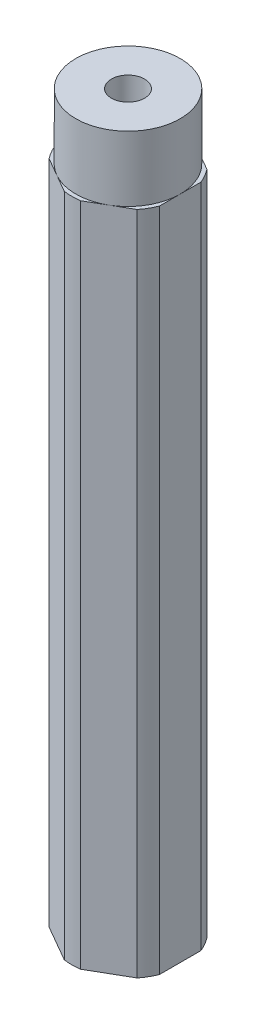
ISO-10303-21;
HEADER;
FILE_DESCRIPTION(('STEP AP214'),'2;1');
FILE_NAME('part.step','',(''),(''),'','','');
FILE_SCHEMA(('AUTOMOTIVE_DESIGN { 1 0 10303 214 1 1 1 1 }'));
ENDSEC;
DATA;
#1=APPLICATION_CONTEXT('core data for automotive mechanical design processes');
#2=APPLICATION_PROTOCOL_DEFINITION('international standard','automotive_design',2000,#1);
#3=PRODUCT_CONTEXT('',#1,'mechanical');
#4=PRODUCT('Part','Part','',(#3));
#5=PRODUCT_RELATED_PRODUCT_CATEGORY('part','',(#4));
#6=PRODUCT_DEFINITION_FORMATION('','',#4);
#7=PRODUCT_DEFINITION_CONTEXT('part definition',#1,'design');
#8=PRODUCT_DEFINITION('design','',#6,#7);
#9=PRODUCT_DEFINITION_SHAPE('','',#8);
#10=(LENGTH_UNIT() NAMED_UNIT(*) SI_UNIT(.MILLI.,.METRE.));
#11=(NAMED_UNIT(*) PLANE_ANGLE_UNIT() SI_UNIT($,.RADIAN.));
#12=(NAMED_UNIT(*) SI_UNIT($,.STERADIAN.) SOLID_ANGLE_UNIT());
#13=UNCERTAINTY_MEASURE_WITH_UNIT(LENGTH_MEASURE(1.E-05),#10,'distance_accuracy_value','');
#14=(GEOMETRIC_REPRESENTATION_CONTEXT(3) GLOBAL_UNCERTAINTY_ASSIGNED_CONTEXT((#13)) GLOBAL_UNIT_ASSIGNED_CONTEXT((#10,
#11,#12)) REPRESENTATION_CONTEXT('',''));
#15=CARTESIAN_POINT('',(0.,0.,0.));
#16=DIRECTION('',(0.,0.,1.));
#17=DIRECTION('',(1.,0.,0.));
#18=AXIS2_PLACEMENT_3D('',#15,#16,#17);
#19=CARTESIAN_POINT('',(0.,40.48125,0.));
#20=DIRECTION('',(0.,1.,0.));
#21=DIRECTION('',(0.,0.,1.));
#22=AXIS2_PLACEMENT_3D('',#19,#20,#21);
#23=PLANE('',#22);
#24=CARTESIAN_POINT('',(0.,40.48125,0.));
#25=DIRECTION('',(0.,1.,0.));
#26=DIRECTION('',(0.,0.,1.));
#27=AXIS2_PLACEMENT_3D('',#24,#25,#26);
#28=CIRCLE('',#27,6.35);
#29=CARTESIAN_POINT('',(3.175,40.48125,5.49926131403119));
#30=VERTEX_POINT('',#29);
#31=CARTESIAN_POINT('',(6.35,40.48125,0.));
#32=VERTEX_POINT('',#31);
#33=EDGE_CURVE('E64',#30,#32,#28,.T.);
#34=ORIENTED_EDGE('',*,*,#33,.F.);
#35=DIRECTION('',(0.866025403784439,0.,-0.5));
#36=VECTOR('',#35,1.);
#37=CARTESIAN_POINT('',(3.175,40.48125,5.49926131403119));
#38=LINE('',#37,#36);
#39=CARTESIAN_POINT('',(5.35936308108336,40.48125,4.23811870115983));
#40=VERTEX_POINT('',#39);
#41=EDGE_CURVE('E171',#30,#40,#38,.T.);
#42=ORIENTED_EDGE('',*,*,#41,.T.);
#43=CARTESIAN_POINT('',(0.,40.48125,0.));
#44=DIRECTION('',(0.,1.,0.));
#45=DIRECTION('',(0.,0.,1.));
#46=AXIS2_PLACEMENT_3D('',#43,#44,#45);
#47=CIRCLE('',#46,6.8326);
#48=CARTESIAN_POINT('',(6.35,40.48125,2.52228522574271));
#49=VERTEX_POINT('',#48);
#50=EDGE_CURVE('E170',#40,#49,#47,.T.);
#51=ORIENTED_EDGE('',*,*,#50,.T.);
#52=DIRECTION('',(0.,0.,-1.));
#53=VECTOR('',#52,1.);
#54=CARTESIAN_POINT('',(6.35,40.48125,0.));
#55=LINE('',#54,#53);
#56=EDGE_CURVE('E183',#49,#32,#55,.T.);
#57=ORIENTED_EDGE('',*,*,#56,.T.);
#58=EDGE_LOOP('',(#34,#42,#51,#57));
#59=FACE_BOUND('',#58,.T.);
#60=ADVANCED_FACE('F53',(#59),#23,.T.);
#61=CARTESIAN_POINT('',(3.175,40.48125,-5.49926131403119));
#62=VERTEX_POINT('',#61);
#63=EDGE_CURVE('E11',#32,#62,#28,.T.);
#64=ORIENTED_EDGE('',*,*,#63,.F.);
#65=CARTESIAN_POINT('',(6.35,40.48125,-2.52228522574271));
#66=VERTEX_POINT('',#65);
#67=EDGE_CURVE('E195',#32,#66,#55,.T.);
#68=ORIENTED_EDGE('',*,*,#67,.T.);
#69=CARTESIAN_POINT('',(5.35936308108336,40.48125,-4.23811870115983));
#70=VERTEX_POINT('',#69);
#71=EDGE_CURVE('E196',#66,#70,#47,.T.);
#72=ORIENTED_EDGE('',*,*,#71,.T.);
#73=DIRECTION('',(-0.866025403784439,0.,-0.5));
#74=VECTOR('',#73,1.);
#75=CARTESIAN_POINT('',(3.175,40.48125,-5.49926131403119));
#76=LINE('',#75,#74);
#77=EDGE_CURVE('E198',#70,#62,#76,.T.);
#78=ORIENTED_EDGE('',*,*,#77,.T.);
#79=EDGE_LOOP('',(#64,#68,#72,#78));
#80=FACE_BOUND('',#79,.T.);
#81=ADVANCED_FACE('F318',(#80),#23,.T.);
#82=CARTESIAN_POINT('',(-3.175,40.48125,-5.49926131403119));
#83=VERTEX_POINT('',#82);
#84=EDGE_CURVE('E62',#62,#83,#28,.T.);
#85=ORIENTED_EDGE('',*,*,#84,.F.);
#86=CARTESIAN_POINT('',(0.990636918916644,40.48125,-6.76040392690255));
#87=VERTEX_POINT('',#86);
#88=EDGE_CURVE('E202',#62,#87,#76,.T.);
#89=ORIENTED_EDGE('',*,*,#88,.T.);
#90=CARTESIAN_POINT('',(-0.990636918916643,40.48125,-6.76040392690255));
#91=VERTEX_POINT('',#90);
#92=EDGE_CURVE('E201',#87,#91,#47,.T.);
#93=ORIENTED_EDGE('',*,*,#92,.T.);
#94=DIRECTION('',(-0.866025403784439,0.,0.5));
#95=VECTOR('',#94,1.);
#96=CARTESIAN_POINT('',(-3.175,40.48125,-5.49926131403119));
#97=LINE('',#96,#95);
#98=EDGE_CURVE('E203',#91,#83,#97,.T.);
#99=ORIENTED_EDGE('',*,*,#98,.T.);
#100=EDGE_LOOP('',(#85,#89,#93,#99));
#101=FACE_BOUND('',#100,.T.);
#102=ADVANCED_FACE('F306',(#101),#23,.T.);
#103=CARTESIAN_POINT('',(-6.35,40.48125,0.));
#104=VERTEX_POINT('',#103);
#105=EDGE_CURVE('E189',#83,#104,#28,.T.);
#106=ORIENTED_EDGE('',*,*,#105,.F.);
#107=CARTESIAN_POINT('',(-5.35936308108336,40.48125,-4.23811870115983));
#108=VERTEX_POINT('',#107);
#109=EDGE_CURVE('E207',#83,#108,#97,.T.);
#110=ORIENTED_EDGE('',*,*,#109,.T.);
#111=CARTESIAN_POINT('',(-6.35,40.48125,-2.52228522574272));
#112=VERTEX_POINT('',#111);
#113=EDGE_CURVE('E206',#108,#112,#47,.T.);
#114=ORIENTED_EDGE('',*,*,#113,.T.);
#115=DIRECTION('',(0.,0.,1.));
#116=VECTOR('',#115,1.);
#117=CARTESIAN_POINT('',(-6.35,40.48125,0.));
#118=LINE('',#117,#116);
#119=EDGE_CURVE('E208',#112,#104,#118,.T.);
#120=ORIENTED_EDGE('',*,*,#119,.T.);
#121=EDGE_LOOP('',(#106,#110,#114,#120));
#122=FACE_BOUND('',#121,.T.);
#123=ADVANCED_FACE('F349',(#122),#23,.T.);
#124=CARTESIAN_POINT('',(-3.175,40.48125,5.49926131403119));
#125=VERTEX_POINT('',#124);
#126=EDGE_CURVE('E79',#104,#125,#28,.T.);
#127=ORIENTED_EDGE('',*,*,#126,.F.);
#128=CARTESIAN_POINT('',(-6.35,40.48125,2.52228522574272));
#129=VERTEX_POINT('',#128);
#130=EDGE_CURVE('E212',#104,#129,#118,.T.);
#131=ORIENTED_EDGE('',*,*,#130,.T.);
#132=CARTESIAN_POINT('',(-5.35936308108336,40.48125,4.23811870115983));
#133=VERTEX_POINT('',#132);
#134=EDGE_CURVE('E211',#129,#133,#47,.T.);
#135=ORIENTED_EDGE('',*,*,#134,.T.);
#136=DIRECTION('',(0.866025403784439,0.,0.5));
#137=VECTOR('',#136,1.);
#138=CARTESIAN_POINT('',(-3.175,40.48125,5.49926131403119));
#139=LINE('',#138,#137);
#140=EDGE_CURVE('E213',#133,#125,#139,.T.);
#141=ORIENTED_EDGE('',*,*,#140,.T.);
#142=EDGE_LOOP('',(#127,#131,#135,#141));
#143=FACE_BOUND('',#142,.T.);
#144=ADVANCED_FACE('F341',(#143),#23,.T.);
#145=CARTESIAN_POINT('',(3.175,40.48125,5.49926131403119));
#146=DIRECTION('',(-0.5,0.,-0.866025403784439));
#147=DIRECTION('',(-0.866025403784439,0.,0.5));
#148=AXIS2_PLACEMENT_3D('',#145,#146,#147);
#149=PLANE('',#148);
#150=DIRECTION('',(0.866025403784439,0.,-0.5));
#151=VECTOR('',#150,1.);
#152=CARTESIAN_POINT('',(3.175,-40.48125,5.49926131403119));
#153=LINE('',#152,#151);
#154=CARTESIAN_POINT('',(0.990636918916649,-40.48125,6.76040392690254));
#155=VERTEX_POINT('',#154);
#156=CARTESIAN_POINT('',(5.35936308108336,-40.48125,4.23811870115983));
#157=VERTEX_POINT('',#156);
#158=EDGE_CURVE('E216',#155,#157,#153,.T.);
#159=ORIENTED_EDGE('',*,*,#158,.T.);
#160=DIRECTION('',(0.,-1.,0.));
#161=VECTOR('',#160,1.);
#162=CARTESIAN_POINT('',(5.35936308108336,40.48125,4.23811870115983));
#163=LINE('',#162,#161);
#164=EDGE_CURVE('E57',#40,#157,#163,.T.);
#165=ORIENTED_EDGE('',*,*,#164,.F.);
#166=ORIENTED_EDGE('',*,*,#41,.F.);
#167=CARTESIAN_POINT('',(0.990636918916649,40.48125,6.76040392690254));
#168=VERTEX_POINT('',#167);
#169=EDGE_CURVE('E162',#168,#30,#38,.T.);
#170=ORIENTED_EDGE('',*,*,#169,.F.);
#171=DIRECTION('',(0.,-1.,0.));
#172=VECTOR('',#171,1.);
#173=CARTESIAN_POINT('',(0.990636918916649,40.48125,6.76040392690254));
#174=LINE('',#173,#172);
#175=EDGE_CURVE('E234',#168,#155,#174,.T.);
#176=ORIENTED_EDGE('',*,*,#175,.T.);
#177=EDGE_LOOP('',(#159,#165,#166,#170,#176));
#178=FACE_BOUND('',#177,.T.);
#179=ADVANCED_FACE('F55',(#178),#149,.F.);
#180=CARTESIAN_POINT('',(0.,40.48125,0.));
#181=DIRECTION('',(0.,-1.,0.));
#182=DIRECTION('',(0.,0.,-1.));
#183=AXIS2_PLACEMENT_3D('',#180,#181,#182);
#184=CYLINDRICAL_SURFACE('',#183,6.8326);
#185=CARTESIAN_POINT('',(0.,-40.48125,0.));
#186=DIRECTION('',(0.,1.,0.));
#187=DIRECTION('',(0.,0.,1.));
#188=AXIS2_PLACEMENT_3D('',#185,#186,#187);
#189=CIRCLE('',#188,6.8326);
#190=CARTESIAN_POINT('',(6.35,-40.48125,2.52228522574271));
#191=VERTEX_POINT('',#190);
#192=EDGE_CURVE('E218',#157,#191,#189,.T.);
#193=ORIENTED_EDGE('',*,*,#192,.T.);
#194=DIRECTION('',(0.,-1.,0.));
#195=VECTOR('',#194,1.);
#196=CARTESIAN_POINT('',(6.35,40.48125,2.52228522574271));
#197=LINE('',#196,#195);
#198=EDGE_CURVE('E190',#49,#191,#197,.T.);
#199=ORIENTED_EDGE('',*,*,#198,.F.);
#200=ORIENTED_EDGE('',*,*,#50,.F.);
#201=ORIENTED_EDGE('',*,*,#164,.T.);
#202=EDGE_LOOP('',(#193,#199,#200,#201));
#203=FACE_BOUND('',#202,.T.);
#204=ADVANCED_FACE('F322',(#203),#184,.T.);
#205=CARTESIAN_POINT('',(6.35,40.48125,0.));
#206=DIRECTION('',(-1.,0.,0.));
#207=DIRECTION('',(0.,0.,1.));
#208=AXIS2_PLACEMENT_3D('',#205,#206,#207);
#209=PLANE('',#208);
#210=DIRECTION('',(0.,0.,-1.));
#211=VECTOR('',#210,1.);
#212=CARTESIAN_POINT('',(6.35,-40.48125,0.));
#213=LINE('',#212,#211);
#214=CARTESIAN_POINT('',(6.35,-40.48125,-2.52228522574271));
#215=VERTEX_POINT('',#214);
#216=EDGE_CURVE('E220',#191,#215,#213,.T.);
#217=ORIENTED_EDGE('',*,*,#216,.T.);
#218=DIRECTION('',(0.,-1.,0.));
#219=VECTOR('',#218,1.);
#220=CARTESIAN_POINT('',(6.35,40.48125,-2.52228522574271));
#221=LINE('',#220,#219);
#222=EDGE_CURVE('E260',#66,#215,#221,.T.);
#223=ORIENTED_EDGE('',*,*,#222,.F.);
#224=ORIENTED_EDGE('',*,*,#67,.F.);
#225=ORIENTED_EDGE('',*,*,#56,.F.);
#226=ORIENTED_EDGE('',*,*,#198,.T.);
#227=EDGE_LOOP('',(#217,#223,#224,#225,#226));
#228=FACE_BOUND('',#227,.T.);
#229=ADVANCED_FACE('F266',(#228),#209,.F.);
#230=CARTESIAN_POINT('',(5.35936308108336,-40.48125,-4.23811870115983));
#231=VERTEX_POINT('',#230);
#232=EDGE_CURVE('E221',#215,#231,#189,.T.);
#233=ORIENTED_EDGE('',*,*,#232,.T.);
#234=DIRECTION('',(0.,-1.,0.));
#235=VECTOR('',#234,1.);
#236=CARTESIAN_POINT('',(5.35936308108336,40.48125,-4.23811870115983));
#237=LINE('',#236,#235);
#238=EDGE_CURVE('E257',#70,#231,#237,.T.);
#239=ORIENTED_EDGE('',*,*,#238,.F.);
#240=ORIENTED_EDGE('',*,*,#71,.F.);
#241=ORIENTED_EDGE('',*,*,#222,.T.);
#242=EDGE_LOOP('',(#233,#239,#240,#241));
#243=FACE_BOUND('',#242,.T.);
#244=ADVANCED_FACE('F319',(#243),#184,.T.);
#245=CARTESIAN_POINT('',(3.175,40.48125,-5.49926131403119));
#246=DIRECTION('',(-0.5,0.,0.866025403784439));
#247=DIRECTION('',(0.866025403784439,0.,0.5));
#248=AXIS2_PLACEMENT_3D('',#245,#246,#247);
#249=PLANE('',#248);
#250=DIRECTION('',(-0.866025403784439,0.,-0.5));
#251=VECTOR('',#250,1.);
#252=CARTESIAN_POINT('',(3.175,-40.48125,-5.49926131403119));
#253=LINE('',#252,#251);
#254=CARTESIAN_POINT('',(0.990636918916644,-40.48125,-6.76040392690255));
#255=VERTEX_POINT('',#254);
#256=EDGE_CURVE('E223',#231,#255,#253,.T.);
#257=ORIENTED_EDGE('',*,*,#256,.T.);
#258=DIRECTION('',(0.,-1.,0.));
#259=VECTOR('',#258,1.);
#260=CARTESIAN_POINT('',(0.990636918916644,40.48125,-6.76040392690255));
#261=LINE('',#260,#259);
#262=EDGE_CURVE('E254',#87,#255,#261,.T.);
#263=ORIENTED_EDGE('',*,*,#262,.F.);
#264=ORIENTED_EDGE('',*,*,#88,.F.);
#265=ORIENTED_EDGE('',*,*,#77,.F.);
#266=ORIENTED_EDGE('',*,*,#238,.T.);
#267=EDGE_LOOP('',(#257,#263,#264,#265,#266));
#268=FACE_BOUND('',#267,.T.);
#269=ADVANCED_FACE('F310',(#268),#249,.F.);
#270=CARTESIAN_POINT('',(-0.990636918916643,-40.48125,-6.76040392690255));
#271=VERTEX_POINT('',#270);
#272=EDGE_CURVE('E225',#255,#271,#189,.T.);
#273=ORIENTED_EDGE('',*,*,#272,.T.);
#274=DIRECTION('',(0.,-1.,0.));
#275=VECTOR('',#274,1.);
#276=CARTESIAN_POINT('',(-0.990636918916643,40.48125,-6.76040392690255));
#277=LINE('',#276,#275);
#278=EDGE_CURVE('E251',#91,#271,#277,.T.);
#279=ORIENTED_EDGE('',*,*,#278,.F.);
#280=ORIENTED_EDGE('',*,*,#92,.F.);
#281=ORIENTED_EDGE('',*,*,#262,.T.);
#282=EDGE_LOOP('',(#273,#279,#280,#281));
#283=FACE_BOUND('',#282,.T.);
#284=ADVANCED_FACE('F311',(#283),#184,.T.);
#285=CARTESIAN_POINT('',(-3.175,40.48125,-5.49926131403119));
#286=DIRECTION('',(0.5,0.,0.866025403784439));
#287=DIRECTION('',(0.866025403784439,0.,-0.5));
#288=AXIS2_PLACEMENT_3D('',#285,#286,#287);
#289=PLANE('',#288);
#290=DIRECTION('',(-0.866025403784439,0.,0.5));
#291=VECTOR('',#290,1.);
#292=CARTESIAN_POINT('',(-3.175,-40.48125,-5.49926131403119));
#293=LINE('',#292,#291);
#294=CARTESIAN_POINT('',(-5.35936308108336,-40.48125,-4.23811870115983));
#295=VERTEX_POINT('',#294);
#296=EDGE_CURVE('E226',#271,#295,#293,.T.);
#297=ORIENTED_EDGE('',*,*,#296,.T.);
#298=DIRECTION('',(0.,-1.,0.));
#299=VECTOR('',#298,1.);
#300=CARTESIAN_POINT('',(-5.35936308108336,40.48125,-4.23811870115983));
#301=LINE('',#300,#299);
#302=EDGE_CURVE('E248',#108,#295,#301,.T.);
#303=ORIENTED_EDGE('',*,*,#302,.F.);
#304=ORIENTED_EDGE('',*,*,#109,.F.);
#305=ORIENTED_EDGE('',*,*,#98,.F.);
#306=ORIENTED_EDGE('',*,*,#278,.T.);
#307=EDGE_LOOP('',(#297,#303,#304,#305,#306));
#308=FACE_BOUND('',#307,.T.);
#309=ADVANCED_FACE('F316',(#308),#289,.F.);
#310=CARTESIAN_POINT('',(-6.35,-40.48125,-2.52228522574272));
#311=VERTEX_POINT('',#310);
#312=EDGE_CURVE('E228',#295,#311,#189,.T.);
#313=ORIENTED_EDGE('',*,*,#312,.T.);
#314=DIRECTION('',(0.,-1.,0.));
#315=VECTOR('',#314,1.);
#316=CARTESIAN_POINT('',(-6.35,40.48125,-2.52228522574272));
#317=LINE('',#316,#315);
#318=EDGE_CURVE('E245',#112,#311,#317,.T.);
#319=ORIENTED_EDGE('',*,*,#318,.F.);
#320=ORIENTED_EDGE('',*,*,#113,.F.);
#321=ORIENTED_EDGE('',*,*,#302,.T.);
#322=EDGE_LOOP('',(#313,#319,#320,#321));
#323=FACE_BOUND('',#322,.T.);
#324=ADVANCED_FACE('F332',(#323),#184,.T.);
#325=CARTESIAN_POINT('',(-6.35,40.48125,0.));
#326=DIRECTION('',(1.,0.,0.));
#327=DIRECTION('',(0.,0.,-1.));
#328=AXIS2_PLACEMENT_3D('',#325,#326,#327);
#329=PLANE('',#328);
#330=DIRECTION('',(0.,0.,1.));
#331=VECTOR('',#330,1.);
#332=CARTESIAN_POINT('',(-6.35,-40.48125,0.));
#333=LINE('',#332,#331);
#334=CARTESIAN_POINT('',(-6.35,-40.48125,2.52228522574272));
#335=VERTEX_POINT('',#334);
#336=EDGE_CURVE('E229',#311,#335,#333,.T.);
#337=ORIENTED_EDGE('',*,*,#336,.T.);
#338=DIRECTION('',(0.,-1.,0.));
#339=VECTOR('',#338,1.);
#340=CARTESIAN_POINT('',(-6.35,40.48125,2.52228522574272));
#341=LINE('',#340,#339);
#342=EDGE_CURVE('E242',#129,#335,#341,.T.);
#343=ORIENTED_EDGE('',*,*,#342,.F.);
#344=ORIENTED_EDGE('',*,*,#130,.F.);
#345=ORIENTED_EDGE('',*,*,#119,.F.);
#346=ORIENTED_EDGE('',*,*,#318,.T.);
#347=EDGE_LOOP('',(#337,#343,#344,#345,#346));
#348=FACE_BOUND('',#347,.T.);
#349=ADVANCED_FACE('F359',(#348),#329,.F.);
#350=CARTESIAN_POINT('',(-5.35936308108336,-40.48125,4.23811870115983));
#351=VERTEX_POINT('',#350);
#352=EDGE_CURVE('E231',#335,#351,#189,.T.);
#353=ORIENTED_EDGE('',*,*,#352,.T.);
#354=DIRECTION('',(0.,-1.,0.));
#355=VECTOR('',#354,1.);
#356=CARTESIAN_POINT('',(-5.35936308108336,40.48125,4.23811870115983));
#357=LINE('',#356,#355);
#358=EDGE_CURVE('E239',#133,#351,#357,.T.);
#359=ORIENTED_EDGE('',*,*,#358,.F.);
#360=ORIENTED_EDGE('',*,*,#134,.F.);
#361=ORIENTED_EDGE('',*,*,#342,.T.);
#362=EDGE_LOOP('',(#353,#359,#360,#361));
#363=FACE_BOUND('',#362,.T.);
#364=ADVANCED_FACE('F296',(#363),#184,.T.);
#365=CARTESIAN_POINT('',(-3.175,40.48125,5.49926131403119));
#366=DIRECTION('',(0.5,0.,-0.866025403784439));
#367=DIRECTION('',(-0.866025403784439,0.,-0.5));
#368=AXIS2_PLACEMENT_3D('',#365,#366,#367);
#369=PLANE('',#368);
#370=DIRECTION('',(0.866025403784439,0.,0.5));
#371=VECTOR('',#370,1.);
#372=CARTESIAN_POINT('',(-3.175,-40.48125,5.49926131403119));
#373=LINE('',#372,#371);
#374=CARTESIAN_POINT('',(-0.990636918916633,-40.48125,6.76040392690255));
#375=VERTEX_POINT('',#374);
#376=EDGE_CURVE('E232',#351,#375,#373,.T.);
#377=ORIENTED_EDGE('',*,*,#376,.T.);
#378=DIRECTION('',(0.,-1.,0.));
#379=VECTOR('',#378,1.);
#380=CARTESIAN_POINT('',(-0.990636918916633,40.48125,6.76040392690255));
#381=LINE('',#380,#379);
#382=CARTESIAN_POINT('',(-0.990636918916633,40.48125,6.76040392690255));
#383=VERTEX_POINT('',#382);
#384=EDGE_CURVE('E236',#383,#375,#381,.T.);
#385=ORIENTED_EDGE('',*,*,#384,.F.);
#386=EDGE_CURVE('E215',#125,#383,#139,.T.);
#387=ORIENTED_EDGE('',*,*,#386,.F.);
#388=ORIENTED_EDGE('',*,*,#140,.F.);
#389=ORIENTED_EDGE('',*,*,#358,.T.);
#390=EDGE_LOOP('',(#377,#385,#387,#388,#389));
#391=FACE_BOUND('',#390,.T.);
#392=ADVANCED_FACE('F293',(#391),#369,.F.);
#393=EDGE_CURVE('E179',#375,#155,#189,.T.);
#394=ORIENTED_EDGE('',*,*,#393,.T.);
#395=ORIENTED_EDGE('',*,*,#175,.F.);
#396=EDGE_CURVE('E166',#383,#168,#47,.T.);
#397=ORIENTED_EDGE('',*,*,#396,.F.);
#398=ORIENTED_EDGE('',*,*,#384,.T.);
#399=EDGE_LOOP('',(#394,#395,#397,#398));
#400=FACE_BOUND('',#399,.T.);
#401=ADVANCED_FACE('F288',(#400),#184,.T.);
#402=EDGE_CURVE('E71',#125,#30,#28,.T.);
#403=ORIENTED_EDGE('',*,*,#402,.F.);
#404=ORIENTED_EDGE('',*,*,#386,.T.);
#405=ORIENTED_EDGE('',*,*,#396,.T.);
#406=ORIENTED_EDGE('',*,*,#169,.T.);
#407=EDGE_LOOP('',(#403,#404,#405,#406));
#408=FACE_BOUND('',#407,.T.);
#409=ADVANCED_FACE('F164',(#408),#23,.T.);
#410=CARTESIAN_POINT('',(0.,-40.48125,0.));
#411=DIRECTION('',(0.,1.,0.));
#412=DIRECTION('',(0.,0.,1.));
#413=AXIS2_PLACEMENT_3D('',#410,#411,#412);
#414=PLANE('',#413);
#415=CARTESIAN_POINT('',(0.,-40.48125,0.));
#416=DIRECTION('',(0.,-1.,0.));
#417=DIRECTION('',(0.,0.,-1.));
#418=AXIS2_PLACEMENT_3D('',#415,#416,#417);
#419=CIRCLE('',#418,2.01929999999999);
#420=CARTESIAN_POINT('',(0.,-40.48125,-2.01929999999999));
#421=VERTEX_POINT('',#420);
#422=EDGE_CURVE('E186',#421,#421,#419,.T.);
#423=ORIENTED_EDGE('',*,*,#422,.F.);
#424=EDGE_LOOP('',(#423));
#425=FACE_BOUND('',#424,.T.);
#426=ORIENTED_EDGE('',*,*,#158,.F.);
#427=ORIENTED_EDGE('',*,*,#393,.F.);
#428=ORIENTED_EDGE('',*,*,#376,.F.);
#429=ORIENTED_EDGE('',*,*,#352,.F.);
#430=ORIENTED_EDGE('',*,*,#336,.F.);
#431=ORIENTED_EDGE('',*,*,#312,.F.);
#432=ORIENTED_EDGE('',*,*,#296,.F.);
#433=ORIENTED_EDGE('',*,*,#272,.F.);
#434=ORIENTED_EDGE('',*,*,#256,.F.);
#435=ORIENTED_EDGE('',*,*,#232,.F.);
#436=ORIENTED_EDGE('',*,*,#216,.F.);
#437=ORIENTED_EDGE('',*,*,#192,.F.);
#438=EDGE_LOOP('',(#426,#427,#428,#429,#430,#431,#432,#433,#434,#435,#436,#437));
#439=FACE_BOUND('',#438,.T.);
#440=ADVANCED_FACE('F273',(#425,#439),#414,.F.);
#441=CARTESIAN_POINT('',(0.,48.41875,0.));
#442=DIRECTION('',(0.,-1.,0.));
#443=DIRECTION('',(0.,0.,-1.));
#444=AXIS2_PLACEMENT_3D('',#441,#442,#443);
#445=CYLINDRICAL_SURFACE('',#444,6.35);
#446=CARTESIAN_POINT('',(0.,48.41875,0.));
#447=DIRECTION('',(0.,1.,0.));
#448=DIRECTION('',(0.,0.,1.));
#449=AXIS2_PLACEMENT_3D('',#446,#447,#448);
#450=CIRCLE('',#449,6.35);
#451=CARTESIAN_POINT('',(0.,48.41875,6.35));
#452=VERTEX_POINT('',#451);
#453=EDGE_CURVE('E185',#452,#452,#450,.T.);
#454=ORIENTED_EDGE('',*,*,#453,.F.);
#455=EDGE_LOOP('',(#454));
#456=FACE_BOUND('',#455,.T.);
#457=ORIENTED_EDGE('',*,*,#33,.T.);
#458=ORIENTED_EDGE('',*,*,#63,.T.);
#459=ORIENTED_EDGE('',*,*,#84,.T.);
#460=ORIENTED_EDGE('',*,*,#105,.T.);
#461=ORIENTED_EDGE('',*,*,#126,.T.);
#462=ORIENTED_EDGE('',*,*,#402,.T.);
#463=EDGE_LOOP('',(#457,#458,#459,#460,#461,#462));
#464=FACE_BOUND('',#463,.T.);
#465=ADVANCED_FACE('F187',(#456,#464),#445,.T.);
#466=CARTESIAN_POINT('',(0.,48.41875,0.));
#467=DIRECTION('',(0.,1.,0.));
#468=DIRECTION('',(0.,0.,1.));
#469=AXIS2_PLACEMENT_3D('',#466,#467,#468);
#470=PLANE('',#469);
#471=CARTESIAN_POINT('',(0.,48.41875,0.));
#472=DIRECTION('',(0.,1.,0.));
#473=DIRECTION('',(0.,0.,1.));
#474=AXIS2_PLACEMENT_3D('',#471,#472,#473);
#475=CIRCLE('',#474,2.0193);
#476=CARTESIAN_POINT('',(0.,48.41875,2.0193));
#477=VERTEX_POINT('',#476);
#478=EDGE_CURVE('E516',#477,#477,#475,.T.);
#479=ORIENTED_EDGE('',*,*,#478,.F.);
#480=EDGE_LOOP('',(#479));
#481=FACE_BOUND('',#480,.T.);
#482=ORIENTED_EDGE('',*,*,#453,.T.);
#483=EDGE_LOOP('',(#482));
#484=FACE_BOUND('',#483,.T.);
#485=ADVANCED_FACE('F471',(#481,#484),#470,.T.);
#486=CARTESIAN_POINT('',(0.,-40.48125,0.));
#487=DIRECTION('',(0.,-1.,0.));
#488=DIRECTION('',(0.,0.,-1.));
#489=AXIS2_PLACEMENT_3D('',#486,#487,#488);
#490=CYLINDRICAL_SURFACE('',#489,2.01929999999999);
#491=ORIENTED_EDGE('',*,*,#422,.T.);
#492=EDGE_LOOP('',(#491));
#493=FACE_BOUND('',#492,.T.);
#494=ORIENTED_EDGE('',*,*,#478,.T.);
#495=EDGE_LOOP('',(#494));
#496=FACE_BOUND('',#495,.T.);
#497=ADVANCED_FACE('F479',(#493,#496),#490,.F.);
#498=CLOSED_SHELL('',(#60,#81,#102,#123,#144,#179,#204,#229,#244,#269,#284,#309,#324,#349,#364,
#392,#401,#409,#440,#465,#485,#497));
#499=MANIFOLD_SOLID_BREP('B2',#498);
#500=ADVANCED_BREP_SHAPE_REPRESENTATION('',(#18,#499),#14);
#501=SHAPE_DEFINITION_REPRESENTATION(#9,#500);
ENDSEC;
END-ISO-10303-21;
